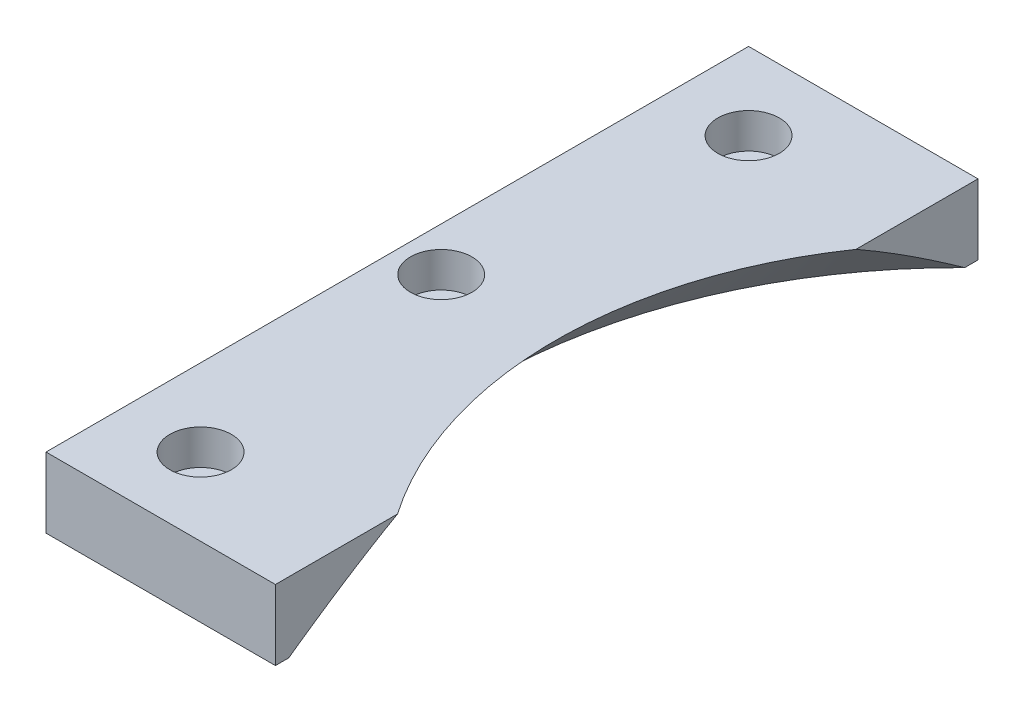
ISO-10303-21;
HEADER;
FILE_DESCRIPTION(('STEP AP214'),'2;1');
FILE_NAME('part.step','',(''),(''),'','','');
FILE_SCHEMA(('AUTOMOTIVE_DESIGN { 1 0 10303 214 1 1 1 1 }'));
ENDSEC;
DATA;
#1=APPLICATION_CONTEXT('core data for automotive mechanical design processes');
#2=APPLICATION_PROTOCOL_DEFINITION('international standard','automotive_design',2000,#1);
#3=PRODUCT_CONTEXT('',#1,'mechanical');
#4=PRODUCT('Part','Part','',(#3));
#5=PRODUCT_RELATED_PRODUCT_CATEGORY('part','',(#4));
#6=PRODUCT_DEFINITION_FORMATION('','',#4);
#7=PRODUCT_DEFINITION_CONTEXT('part definition',#1,'design');
#8=PRODUCT_DEFINITION('design','',#6,#7);
#9=PRODUCT_DEFINITION_SHAPE('','',#8);
#10=(LENGTH_UNIT() NAMED_UNIT(*) SI_UNIT(.MILLI.,.METRE.));
#11=(NAMED_UNIT(*) PLANE_ANGLE_UNIT() SI_UNIT($,.RADIAN.));
#12=(NAMED_UNIT(*) SI_UNIT($,.STERADIAN.) SOLID_ANGLE_UNIT());
#13=UNCERTAINTY_MEASURE_WITH_UNIT(LENGTH_MEASURE(1.E-05),#10,'distance_accuracy_value','');
#14=(GEOMETRIC_REPRESENTATION_CONTEXT(3) GLOBAL_UNCERTAINTY_ASSIGNED_CONTEXT((#13)) GLOBAL_UNIT_ASSIGNED_CONTEXT((#10,
#11,#12)) REPRESENTATION_CONTEXT('',''));
#15=CARTESIAN_POINT('',(0.,0.,0.));
#16=DIRECTION('',(0.,0.,1.));
#17=DIRECTION('',(1.,0.,0.));
#18=AXIS2_PLACEMENT_3D('',#15,#16,#17);
#19=CARTESIAN_POINT('',(-101.6,12.7,63.5));
#20=DIRECTION('',(0.,0.,-1.));
#21=DIRECTION('',(-1.,0.,0.));
#22=AXIS2_PLACEMENT_3D('',#19,#20,#21);
#23=PLANE('',#22);
#24=DIRECTION('',(1.,0.,0.));
#25=VECTOR('',#24,1.);
#26=CARTESIAN_POINT('',(-101.6,0.,63.5));
#27=LINE('',#26,#25);
#28=CARTESIAN_POINT('',(-101.6,0.,63.5));
#29=VERTEX_POINT('',#28);
#30=CARTESIAN_POINT('',(-60.1292839424142,0.,63.5));
#31=VERTEX_POINT('',#30);
#32=EDGE_CURVE('E127',#29,#31,#27,.T.);
#33=ORIENTED_EDGE('',*,*,#32,.T.);
#34=DIRECTION('',(0.,-1.,0.));
#35=VECTOR('',#34,1.);
#36=CARTESIAN_POINT('',(-60.1292839424142,12.7,63.5));
#37=LINE('',#36,#35);
#38=CARTESIAN_POINT('',(-60.1292839424142,12.7,63.5));
#39=VERTEX_POINT('',#38);
#40=EDGE_CURVE('E69',#39,#31,#37,.T.);
#41=ORIENTED_EDGE('',*,*,#40,.F.);
#42=DIRECTION('',(1.,0.,0.));
#43=VECTOR('',#42,1.);
#44=CARTESIAN_POINT('',(-101.6,12.7,63.5));
#45=LINE('',#44,#43);
#46=CARTESIAN_POINT('',(-101.6,12.7,63.5));
#47=VERTEX_POINT('',#46);
#48=EDGE_CURVE('E123',#47,#39,#45,.T.);
#49=ORIENTED_EDGE('',*,*,#48,.F.);
#50=DIRECTION('',(0.,-1.,0.));
#51=VECTOR('',#50,1.);
#52=CARTESIAN_POINT('',(-101.6,12.7,63.5));
#53=LINE('',#52,#51);
#54=EDGE_CURVE('E121',#47,#29,#53,.T.);
#55=ORIENTED_EDGE('',*,*,#54,.T.);
#56=EDGE_LOOP('',(#33,#41,#49,#55));
#57=FACE_BOUND('',#56,.T.);
#58=ADVANCED_FACE('F46',(#57),#23,.F.);
#59=CARTESIAN_POINT('',(0.,0.,0.));
#60=DIRECTION('',(0.,-1.,0.));
#61=DIRECTION('',(0.,0.,1.));
#62=AXIS2_PLACEMENT_3D('',#59,#60,#61);
#63=CONICAL_SURFACE('',#62,85.725,0.78539816339745);
#64=CARTESIAN_POINT('',(0.,0.,0.));
#65=DIRECTION('',(0.,-1.,0.));
#66=DIRECTION('',(0.,0.,1.));
#67=AXIS2_PLACEMENT_3D('',#64,#65,#66);
#68=CIRCLE('',#67,85.725);
#69=CARTESIAN_POINT('',(-60.1292839424142,0.,61.1002850858532));
#70=VERTEX_POINT('',#69);
#71=CARTESIAN_POINT('',(-60.1292839424142,0.,-61.1002850858532));
#72=VERTEX_POINT('',#71);
#73=EDGE_CURVE('E130',#70,#72,#68,.T.);
#74=ORIENTED_EDGE('',*,*,#73,.T.);
#75=CARTESIAN_POINT('',(-60.1292839424142,-66.7151779488328,-140.080252232941));
#76=CARTESIAN_POINT('',(-60.1292839424142,-64.8105041227983,-138.007458282815));
#77=CARTESIAN_POINT('',(-60.1292839424142,-62.9093328477956,-135.931437634323));
#78=CARTESIAN_POINT('',(-60.1292839424142,-59.1150950880149,-131.771974190512));
#79=CARTESIAN_POINT('',(-60.1292839424142,-57.2220286677997,-129.688531336309));
#80=CARTESIAN_POINT('',(-60.1292839424142,-53.4446952298806,-125.512806341657));
#81=CARTESIAN_POINT('',(-60.1292839424142,-51.5604303415947,-123.420522273977));
#82=CARTESIAN_POINT('',(-60.1292839424142,-47.8025391949186,-119.226425614269));
#83=CARTESIAN_POINT('',(-60.1292839424142,-45.928912914417,-117.124613042063));
#84=CARTESIAN_POINT('',(-60.1292839424142,-42.1822319226953,-112.896831173383));
#85=CARTESIAN_POINT('',(-60.1292839424142,-40.3092548031199,-110.770793075018));
#86=CARTESIAN_POINT('',(-60.1292839424142,-36.5778467817438,-106.505972534798));
#87=CARTESIAN_POINT('',(-60.1292839424142,-34.7194159118044,-104.367190065047));
#88=CARTESIAN_POINT('',(-60.1292839424142,-31.0198983940656,-100.075094384973));
#89=CARTESIAN_POINT('',(-60.1292839424142,-29.17880977515,-97.9217828749536));
#90=CARTESIAN_POINT('',(-60.1292839424142,-25.5169826379989,-93.5979191832601));
#91=CARTESIAN_POINT('',(-60.1292839424142,-23.6962440289681,-91.4273670785817));
#92=CARTESIAN_POINT('',(-60.1292839424142,-20.4018640116852,-87.4550281010579));
#93=CARTESIAN_POINT('',(-60.1292839424142,-18.9242503041055,-85.6565373923945));
#94=CARTESIAN_POINT('',(-60.1292839424142,-15.9883664995357,-82.0438098473816));
#95=CARTESIAN_POINT('',(-60.1292839424142,-14.5300964550652,-80.229572968302));
#96=CARTESIAN_POINT('',(-60.1292839424142,-11.6360236413316,-76.5824411528011));
#97=CARTESIAN_POINT('',(-60.1292839424142,-10.2002270480157,-74.7495413083204));
#98=CARTESIAN_POINT('',(-60.1292839424142,-7.355928665099,-71.0626795366914));
#99=CARTESIAN_POINT('',(-60.1292839424142,-5.94742666429568,-69.2087177726942));
#100=CARTESIAN_POINT('',(-60.1292839424142,-3.16483767366669,-65.4783571529654));
#101=CARTESIAN_POINT('',(-60.1292839424142,-1.79071319820268,-63.6019863558867));
#102=CARTESIAN_POINT('',(-60.1292839424142,0.240533087422979,-60.7659226985404));
#103=CARTESIAN_POINT('',(-60.1292839424142,0.912646019631489,-59.8169530335558));
#104=CARTESIAN_POINT('',(-60.1292839424142,2.24577724986897,-57.9112578961989));
#105=CARTESIAN_POINT('',(-60.1292839424142,2.90679566838311,-56.9545325082204));
#106=CARTESIAN_POINT('',(-60.1292839424142,4.21623853972302,-55.033094204741));
#107=CARTESIAN_POINT('',(-60.1292839424142,4.86466825605269,-54.0683848790403));
#108=CARTESIAN_POINT('',(-60.1292839424142,6.14780929107827,-52.1298988222721));
#109=CARTESIAN_POINT('',(-60.1292839424142,6.78252083401577,-51.1561222397938));
#110=CARTESIAN_POINT('',(-60.1292839424142,8.03657660104929,-49.1988302483792));
#111=CARTESIAN_POINT('',(-60.1292839424142,8.65592213998972,-48.2153156828527));
#112=CARTESIAN_POINT('',(-60.1292839424142,9.87744713691431,-46.2377033371553));
#113=CARTESIAN_POINT('',(-60.1292839424142,10.4796270259889,-45.2436058236224));
#114=CARTESIAN_POINT('',(-60.1292839424142,11.65881660595,-43.2539522199489));
#115=CARTESIAN_POINT('',(-60.1292839424142,12.2360174484062,-42.2585095861522));
#116=CARTESIAN_POINT('',(-60.1292839424142,13.369193089325,-40.2556071671935));
#117=CARTESIAN_POINT('',(-60.1292839424142,13.9251680834358,-39.2481474929103));
#118=CARTESIAN_POINT('',(-60.1292839424142,15.0132994790813,-37.220236353334));
#119=CARTESIAN_POINT('',(-60.1292839424142,15.5454525376028,-36.1997830902547));
#120=CARTESIAN_POINT('',(-60.1292839424142,16.58280987614,-34.1452481084478));
#121=CARTESIAN_POINT('',(-60.1292839424142,17.0880141461079,-33.111166384639));
#122=CARTESIAN_POINT('',(-60.1292839424142,18.06753902295,-31.0297183031837));
#123=CARTESIAN_POINT('',(-60.1292839424142,18.5418912733603,-29.9823669167387));
#124=CARTESIAN_POINT('',(-60.1292839424142,19.4564043843156,-27.8729201551548));
#125=CARTESIAN_POINT('',(-60.1292839424142,19.8965647755202,-26.810824577863));
#126=CARTESIAN_POINT('',(-60.1292839424142,21.1593602795503,-23.6020286496893));
#127=CARTESIAN_POINT('',(-60.1292839424142,21.9247352501614,-21.4319306343359));
#128=CARTESIAN_POINT('',(-60.1292839424142,22.8593566176515,-18.3641991024058));
#129=CARTESIAN_POINT('',(-60.1292839424142,23.1092090777267,-17.4906464157064));
#130=CARTESIAN_POINT('',(-60.1292839424142,23.5767439523241,-15.7350103374083));
#131=CARTESIAN_POINT('',(-60.1292839424142,23.7944303496925,-14.8529280163956));
#132=CARTESIAN_POINT('',(-60.1292839424142,24.195346413324,-13.0809863540706));
#133=CARTESIAN_POINT('',(-60.1292839424142,24.3785772287021,-12.1911272731544));
#134=CARTESIAN_POINT('',(-60.1292839424142,24.7084739307169,-10.4046267362287));
#135=CARTESIAN_POINT('',(-60.1292839424142,24.8551397385326,-9.50798526560313));
#136=CARTESIAN_POINT('',(-60.1292839424142,25.1097113201231,-7.71172059547721));
#137=CARTESIAN_POINT('',(-60.1292839424142,25.2177228871501,-6.81211244176346));
#138=CARTESIAN_POINT('',(-60.1292839424142,25.3941125569493,-5.00900694388113));
#139=CARTESIAN_POINT('',(-60.1292839424142,25.4624908223733,-4.10550961568872));
#140=CARTESIAN_POINT('',(-60.1292839424142,25.5586625239341,-2.29636172464643));
#141=CARTESIAN_POINT('',(-60.1292839424142,25.5864565358033,-1.39071119252468));
#142=CARTESIAN_POINT('',(-60.1292839424142,25.601065357599,0.420922230954417));
#143=CARTESIAN_POINT('',(-60.1292839424142,25.587880142325,1.32690512251582));
#144=CARTESIAN_POINT('',(-60.1292839424142,25.5207004750554,3.13785350356406));
#145=CARTESIAN_POINT('',(-60.1292839424142,25.4666834034577,4.04281815058976));
#146=CARTESIAN_POINT('',(-60.1292839424142,25.3185739687233,5.84944972528749));
#147=CARTESIAN_POINT('',(-60.1292839424142,25.2244815647723,6.75111664960008));
#148=CARTESIAN_POINT('',(-60.1292839424142,24.9974915472354,8.54958116090694));
#149=CARTESIAN_POINT('',(-60.1292839424142,24.864591929233,9.44637849394615));
#150=CARTESIAN_POINT('',(-60.1292839424142,24.5616913180025,11.2336674549911));
#151=CARTESIAN_POINT('',(-60.1292839424142,24.3916901050576,12.1241590456218));
#152=CARTESIAN_POINT('',(-60.1292839424142,24.0160589265646,13.9002983076545));
#153=CARTESIAN_POINT('',(-60.1292839424142,23.8103259950568,14.7859241319574));
#154=CARTESIAN_POINT('',(-60.1292839424142,23.3658181941614,16.5488502948019));
#155=CARTESIAN_POINT('',(-60.1292839424142,23.1270420765986,17.426150317506));
#156=CARTESIAN_POINT('',(-60.1292839424142,22.6188273921493,19.1717360072347));
#157=CARTESIAN_POINT('',(-60.1292839424142,22.3493911426586,20.0400223501373));
#158=CARTESIAN_POINT('',(-60.1292839424142,21.7822166157172,21.7672719090936));
#159=CARTESIAN_POINT('',(-60.1292839424142,21.484477309201,22.626234784891));
#160=CARTESIAN_POINT('',(-60.1292839424142,20.4246733109939,25.5398371917184));
#161=CARTESIAN_POINT('',(-60.1292839424142,19.6000454896787,27.5720225974067));
#162=CARTESIAN_POINT('',(-60.1292839424142,18.2724555086642,30.5798012679618));
#163=CARTESIAN_POINT('',(-60.1292839424142,17.8146712210476,31.5759279003449));
#164=CARTESIAN_POINT('',(-60.1292839424142,16.8720201854102,33.5553198056381));
#165=CARTESIAN_POINT('',(-60.1292839424142,16.3871541249753,34.5385854042987));
#166=CARTESIAN_POINT('',(-60.1292839424142,15.3924038645073,36.4945704037304));
#167=CARTESIAN_POINT('',(-60.1292839424142,14.8824759128718,37.4672674598918));
#168=CARTESIAN_POINT('',(-60.1292839424142,13.8410142464152,39.4010189890836));
#169=CARTESIAN_POINT('',(-60.1292839424142,13.3094803992555,40.3620733907545));
#170=CARTESIAN_POINT('',(-60.1292839424142,12.2272183526804,42.2730785220722));
#171=CARTESIAN_POINT('',(-60.1292839424142,11.6764934243555,43.223031107502));
#172=CARTESIAN_POINT('',(-60.1292839424142,10.5578012170886,45.1127123712399));
#173=CARTESIAN_POINT('',(-60.1292839424142,9.98983397400527,46.0524410708048));
#174=CARTESIAN_POINT('',(-60.1292839424142,8.83168977053155,47.9333487544436));
#175=CARTESIAN_POINT('',(-60.1292839424142,8.2413303583796,48.8744152646486));
#176=CARTESIAN_POINT('',(-60.1292839424142,7.04642448002915,50.7474882716691));
#177=CARTESIAN_POINT('',(-60.1292839424142,6.44187800527495,51.6794947630202));
#178=CARTESIAN_POINT('',(-60.1292839424142,5.22002284344117,53.5351120212098));
#179=CARTESIAN_POINT('',(-60.1292839424142,4.60271401651847,54.4587226958915));
#180=CARTESIAN_POINT('',(-60.1292839424142,3.35658702970031,56.2981529131588));
#181=CARTESIAN_POINT('',(-60.1292839424142,2.72776872695519,57.2139723588368));
#182=CARTESIAN_POINT('',(-60.1292839424142,0.827111525733622,59.9486440460033));
#183=CARTESIAN_POINT('',(-60.1292839424142,-0.460258230272219,61.7567170892624));
#184=CARTESIAN_POINT('',(-60.1292839424142,-3.06900582938046,65.3480416775588));
#185=CARTESIAN_POINT('',(-60.1292839424142,-4.39038332981841,67.131293472418));
#186=CARTESIAN_POINT('',(-60.1292839424142,-6.92803968372796,70.499324512369));
#187=CARTESIAN_POINT('',(-60.1292839424142,-8.14162952499546,72.0861332949625));
#188=CARTESIAN_POINT('',(-60.1292839424142,-10.5884359557615,75.244563291196));
#189=CARTESIAN_POINT('',(-60.1292839424142,-11.8216528151383,76.8161842955205));
#190=CARTESIAN_POINT('',(-60.1292839424142,-14.3050203535618,79.9461154792763));
#191=CARTESIAN_POINT('',(-60.1292839424142,-15.5551719510908,81.5044249291997));
#192=CARTESIAN_POINT('',(-60.1292839424142,-18.0700770933115,84.6091946837501));
#193=CARTESIAN_POINT('',(-60.1292839424142,-19.3348305735044,86.1556550406662));
#194=CARTESIAN_POINT('',(-60.1292839424142,-21.8779207619563,89.2391072986511));
#195=CARTESIAN_POINT('',(-60.1292839424142,-23.1562660347231,90.7760921310573));
#196=CARTESIAN_POINT('',(-60.1292839424142,-25.7241276484374,93.8406980882161));
#197=CARTESIAN_POINT('',(-60.1292839424142,-27.0136439997387,95.3683192042879));
#198=CARTESIAN_POINT('',(-60.1292839424142,-29.6024767220852,98.415148282988));
#199=CARTESIAN_POINT('',(-60.1292839424142,-30.9017927843505,99.9343565081044));
#200=CARTESIAN_POINT('',(-60.1292839424142,-33.5091423226831,102.96526783816));
#201=CARTESIAN_POINT('',(-60.1292839424142,-34.8171757945629,104.476970946704));
#202=CARTESIAN_POINT('',(-60.1292839424142,-38.6357544872334,108.867316645498));
#203=CARTESIAN_POINT('',(-60.1292839424142,-41.1565580110042,111.737040051389));
#204=CARTESIAN_POINT('',(-60.1292839424142,-46.2210024645861,117.456290811767));
#205=CARTESIAN_POINT('',(-60.1292839424142,-48.7646436468573,120.305817942368));
#206=CARTESIAN_POINT('',(-60.1292839424142,-52.5924877835991,124.565576466538));
#207=CARTESIAN_POINT('',(-60.1292839424142,-53.8696511571225,125.982142262436));
#208=CARTESIAN_POINT('',(-60.1292839424142,-56.428248791885,128.811413338891));
#209=CARTESIAN_POINT('',(-60.1292839424142,-57.7096830549979,130.224118617754));
#210=CARTESIAN_POINT('',(-60.1292839424142,-60.276405737082,133.045944903062));
#211=CARTESIAN_POINT('',(-60.1292839424142,-61.5616940391031,134.455066015917));
#212=CARTESIAN_POINT('',(-60.1292839424142,-64.1358392802082,137.270040310396));
#213=CARTESIAN_POINT('',(-60.1292839424142,-65.424696212599,138.675893498141));
#214=CARTESIAN_POINT('',(-60.1292839424142,-66.7151779488328,140.080252232941));
#215=B_SPLINE_CURVE_WITH_KNOTS('',3,(#75,#76,#77,#78,#79,#80,#81,#82,#83,#84,#85,#86,#87,#88,
#89,#90,#91,#92,#93,#94,#95,#96,#97,#98,#99,#100,#101,#102,#103,#104,#105,#106,#107,#108,#109,
#110,#111,#112,#113,#114,#115,#116,#117,#118,#119,#120,#121,#122,#123,#124,#125,#126,#127,#128,
#129,#130,#131,#132,#133,#134,#135,#136,#137,#138,#139,#140,#141,#142,#143,#144,#145,#146,#147,
#148,#149,#150,#151,#152,#153,#154,#155,#156,#157,#158,#159,#160,#161,#162,#163,#164,#165,#166,
#167,#168,#169,#170,#171,#172,#173,#174,#175,#176,#177,#178,#179,#180,#181,#182,#183,#184,#185,
#186,#187,#188,#189,#190,#191,#192,#193,#194,#195,#196,#197,#198,#199,#200,#201,#202,#203,#204,
#205,#206,#207,#208,#209,#210,#211,#212,#213,#214),.UNSPECIFIED.,.F.,.F.,(4,2,2,2,2,2,2,2,2,2,2,
2,2,2,2,2,2,2,2,2,2,2,2,2,2,2,2,2,2,2,2,2,2,2,2,2,2,2,2,2,2,2,2,2,2,2,2,2,2,2,2,2,2,2,2,2,2,2,2,
2,2,2,2,2,2,2,2,2,2,4),(0.,8.44502210851651,16.8901113647666,25.3371477174974,33.7841665073153,
42.2842708877352,50.7843938811708,59.2835388034575,67.7826457900904,74.7654560566486,
81.7482852782448,88.7330009072038,95.7176624676307,102.694342929449,106.182905158723,
109.671429478059,113.158462340483,116.645438159588,120.132114567416,123.618703335127,
127.070514408578,130.522293657446,133.974555797377,137.426819224494,140.875484086348,
144.324196278528,151.218670690548,153.943967004243,156.668925584708,159.393793269984,
162.118666829038,164.836024562074,167.553371143218,170.270679175428,172.98798887867,
175.706804992722,178.425623875715,181.14458321222,183.863558650936,186.590503290911,
189.317550966783,192.04439265997,194.771333535827,201.3447147166,204.6333176413,
207.921837108746,211.216316888394,214.510816850148,217.804757990022,221.098692280019,
224.431294107995,227.763897945795,231.096538319887,234.429220085076,241.08736363025,
247.745440113742,253.738332594222,259.73130755035,265.724608856792,271.717883699966,
277.715189918121,283.712501695387,289.709625285874,295.706745995911,307.165543914654,
318.62446866159,324.346370660501,330.068275170007,335.790007771954,341.511729649745),.UNSPECIFIED.);
#216=CARTESIAN_POINT('',(-60.1292839424142,12.7,-41.4381447168249));
#217=VERTEX_POINT('',#216);
#218=EDGE_CURVE('E62',#72,#217,#215,.T.);
#219=ORIENTED_EDGE('',*,*,#218,.T.);
#220=CARTESIAN_POINT('',(0.,12.7,0.));
#221=DIRECTION('',(0.,1.,0.));
#222=DIRECTION('',(0.,0.,1.));
#223=AXIS2_PLACEMENT_3D('',#220,#221,#222);
#224=CIRCLE('',#223,73.0249999999999);
#225=CARTESIAN_POINT('',(-60.1292839424142,12.7,41.4381447168249));
#226=VERTEX_POINT('',#225);
#227=EDGE_CURVE('E113',#226,#217,#224,.F.);
#228=ORIENTED_EDGE('',*,*,#227,.F.);
#229=EDGE_CURVE('E152',#226,#70,#215,.T.);
#230=ORIENTED_EDGE('',*,*,#229,.T.);
#231=EDGE_LOOP('',(#74,#219,#228,#230));
#232=FACE_BOUND('',#231,.T.);
#233=ADVANCED_FACE('F48',(#232),#63,.F.);
#234=CARTESIAN_POINT('',(-101.6,12.7,-63.5));
#235=DIRECTION('',(0.,0.,1.));
#236=DIRECTION('',(1.,0.,0.));
#237=AXIS2_PLACEMENT_3D('',#234,#235,#236);
#238=PLANE('',#237);
#239=DIRECTION('',(-1.,0.,0.));
#240=VECTOR('',#239,1.);
#241=CARTESIAN_POINT('',(-101.6,12.7,-63.5));
#242=LINE('',#241,#240);
#243=CARTESIAN_POINT('',(-60.1292839424142,12.7,-63.5));
#244=VERTEX_POINT('',#243);
#245=CARTESIAN_POINT('',(-101.6,12.7,-63.5));
#246=VERTEX_POINT('',#245);
#247=EDGE_CURVE('E109',#244,#246,#242,.T.);
#248=ORIENTED_EDGE('',*,*,#247,.F.);
#249=DIRECTION('',(0.,-1.,0.));
#250=VECTOR('',#249,1.);
#251=CARTESIAN_POINT('',(-60.1292839424142,12.7,-63.5));
#252=LINE('',#251,#250);
#253=CARTESIAN_POINT('',(-60.1292839424142,0.,-63.5));
#254=VERTEX_POINT('',#253);
#255=EDGE_CURVE('E97',#244,#254,#252,.T.);
#256=ORIENTED_EDGE('',*,*,#255,.T.);
#257=DIRECTION('',(-1.,0.,0.));
#258=VECTOR('',#257,1.);
#259=CARTESIAN_POINT('',(-101.6,0.,-63.5));
#260=LINE('',#259,#258);
#261=CARTESIAN_POINT('',(-101.6,0.,-63.5));
#262=VERTEX_POINT('',#261);
#263=EDGE_CURVE('E133',#254,#262,#260,.T.);
#264=ORIENTED_EDGE('',*,*,#263,.T.);
#265=DIRECTION('',(0.,-1.,0.));
#266=VECTOR('',#265,1.);
#267=CARTESIAN_POINT('',(-101.6,12.7,-63.5));
#268=LINE('',#267,#266);
#269=EDGE_CURVE('E55',#246,#262,#268,.T.);
#270=ORIENTED_EDGE('',*,*,#269,.F.);
#271=EDGE_LOOP('',(#248,#256,#264,#270));
#272=FACE_BOUND('',#271,.T.);
#273=ADVANCED_FACE('F116',(#272),#238,.F.);
#274=CARTESIAN_POINT('',(-101.6,12.7,63.5));
#275=DIRECTION('',(1.,0.,0.));
#276=DIRECTION('',(0.,0.,-1.));
#277=AXIS2_PLACEMENT_3D('',#274,#275,#276);
#278=PLANE('',#277);
#279=DIRECTION('',(0.,0.,1.));
#280=VECTOR('',#279,1.);
#281=CARTESIAN_POINT('',(-101.6,0.,63.5));
#282=LINE('',#281,#280);
#283=EDGE_CURVE('E135',#262,#29,#282,.T.);
#284=ORIENTED_EDGE('',*,*,#283,.T.);
#285=ORIENTED_EDGE('',*,*,#54,.F.);
#286=DIRECTION('',(0.,0.,1.));
#287=VECTOR('',#286,1.);
#288=CARTESIAN_POINT('',(-101.6,12.7,63.5));
#289=LINE('',#288,#287);
#290=EDGE_CURVE('E119',#246,#47,#289,.T.);
#291=ORIENTED_EDGE('',*,*,#290,.F.);
#292=ORIENTED_EDGE('',*,*,#269,.T.);
#293=EDGE_LOOP('',(#284,#285,#291,#292));
#294=FACE_BOUND('',#293,.T.);
#295=ADVANCED_FACE('F141',(#294),#278,.F.);
#296=CARTESIAN_POINT('',(0.,12.7,0.));
#297=DIRECTION('',(0.,1.,0.));
#298=DIRECTION('',(0.,0.,1.));
#299=AXIS2_PLACEMENT_3D('',#296,#297,#298);
#300=PLANE('',#299);
#301=CARTESIAN_POINT('',(-87.63,12.7,-49.53));
#302=DIRECTION('',(0.,1.,0.));
#303=DIRECTION('',(0.,0.,1.));
#304=AXIS2_PLACEMENT_3D('',#301,#302,#303);
#305=CIRCLE('',#304,5.55625);
#306=CARTESIAN_POINT('',(-87.63,12.7,-43.97375));
#307=VERTEX_POINT('',#306);
#308=EDGE_CURVE('E318',#307,#307,#305,.T.);
#309=ORIENTED_EDGE('',*,*,#308,.F.);
#310=EDGE_LOOP('',(#309));
#311=FACE_BOUND('',#310,.T.);
#312=CARTESIAN_POINT('',(-93.6625,12.7,0.));
#313=DIRECTION('',(0.,1.,0.));
#314=DIRECTION('',(0.,0.,1.));
#315=AXIS2_PLACEMENT_3D('',#312,#313,#314);
#316=CIRCLE('',#315,5.55625);
#317=CARTESIAN_POINT('',(-93.6625,12.7,5.5562499999999));
#318=VERTEX_POINT('',#317);
#319=EDGE_CURVE('E328',#318,#318,#316,.T.);
#320=ORIENTED_EDGE('',*,*,#319,.F.);
#321=EDGE_LOOP('',(#320));
#322=FACE_BOUND('',#321,.T.);
#323=CARTESIAN_POINT('',(-87.63,12.7,49.53));
#324=DIRECTION('',(0.,1.,0.));
#325=DIRECTION('',(0.,0.,1.));
#326=AXIS2_PLACEMENT_3D('',#323,#324,#325);
#327=CIRCLE('',#326,5.55625);
#328=CARTESIAN_POINT('',(-87.63,12.7,55.08625));
#329=VERTEX_POINT('',#328);
#330=EDGE_CURVE('E340',#329,#329,#327,.T.);
#331=ORIENTED_EDGE('',*,*,#330,.F.);
#332=EDGE_LOOP('',(#331));
#333=FACE_BOUND('',#332,.T.);
#334=DIRECTION('',(0.,0.,-1.));
#335=VECTOR('',#334,1.);
#336=CARTESIAN_POINT('',(-60.1292839424142,12.7,63.5));
#337=LINE('',#336,#335);
#338=EDGE_CURVE('E100',#217,#244,#337,.T.);
#339=ORIENTED_EDGE('',*,*,#338,.T.);
#340=ORIENTED_EDGE('',*,*,#247,.T.);
#341=ORIENTED_EDGE('',*,*,#290,.T.);
#342=ORIENTED_EDGE('',*,*,#48,.T.);
#343=EDGE_CURVE('E104',#39,#226,#337,.T.);
#344=ORIENTED_EDGE('',*,*,#343,.T.);
#345=ORIENTED_EDGE('',*,*,#227,.T.);
#346=EDGE_LOOP('',(#339,#340,#341,#342,#344,#345));
#347=FACE_BOUND('',#346,.T.);
#348=ADVANCED_FACE('F108',(#311,#322,#333,#347),#300,.T.);
#349=CARTESIAN_POINT('',(0.,0.,0.));
#350=DIRECTION('',(0.,1.,0.));
#351=DIRECTION('',(0.,0.,1.));
#352=AXIS2_PLACEMENT_3D('',#349,#350,#351);
#353=PLANE('',#352);
#354=CARTESIAN_POINT('',(-87.63,0.,-49.53));
#355=DIRECTION('',(0.,1.,0.));
#356=DIRECTION('',(0.,0.,1.));
#357=AXIS2_PLACEMENT_3D('',#354,#355,#356);
#358=CIRCLE('',#357,3.37820000000001);
#359=CARTESIAN_POINT('',(-87.63,0.,-46.1518));
#360=VERTEX_POINT('',#359);
#361=EDGE_CURVE('E325',#360,#360,#358,.T.);
#362=ORIENTED_EDGE('',*,*,#361,.T.);
#363=EDGE_LOOP('',(#362));
#364=FACE_BOUND('',#363,.T.);
#365=CARTESIAN_POINT('',(-93.6625,0.,0.));
#366=DIRECTION('',(0.,1.,0.));
#367=DIRECTION('',(0.,0.,1.));
#368=AXIS2_PLACEMENT_3D('',#365,#366,#367);
#369=CIRCLE('',#368,3.37820000000001);
#370=CARTESIAN_POINT('',(-93.6625,0.,3.37819999999991));
#371=VERTEX_POINT('',#370);
#372=EDGE_CURVE('E337',#371,#371,#369,.T.);
#373=ORIENTED_EDGE('',*,*,#372,.T.);
#374=EDGE_LOOP('',(#373));
#375=FACE_BOUND('',#374,.T.);
#376=CARTESIAN_POINT('',(-87.63,0.,49.53));
#377=DIRECTION('',(0.,1.,0.));
#378=DIRECTION('',(0.,0.,1.));
#379=AXIS2_PLACEMENT_3D('',#376,#377,#378);
#380=CIRCLE('',#379,3.37820000000001);
#381=CARTESIAN_POINT('',(-87.63,0.,52.9082));
#382=VERTEX_POINT('',#381);
#383=EDGE_CURVE('E349',#382,#382,#380,.T.);
#384=ORIENTED_EDGE('',*,*,#383,.T.);
#385=EDGE_LOOP('',(#384));
#386=FACE_BOUND('',#385,.T.);
#387=ORIENTED_EDGE('',*,*,#263,.F.);
#388=DIRECTION('',(0.,0.,1.));
#389=VECTOR('',#388,1.);
#390=CARTESIAN_POINT('',(-60.1292839424142,0.,0.));
#391=LINE('',#390,#389);
#392=EDGE_CURVE('E13',#254,#72,#391,.T.);
#393=ORIENTED_EDGE('',*,*,#392,.T.);
#394=ORIENTED_EDGE('',*,*,#73,.F.);
#395=DIRECTION('',(0.,0.,-1.));
#396=VECTOR('',#395,1.);
#397=CARTESIAN_POINT('',(-60.1292839424142,0.,63.5));
#398=LINE('',#397,#396);
#399=EDGE_CURVE('E114',#31,#70,#398,.T.);
#400=ORIENTED_EDGE('',*,*,#399,.F.);
#401=ORIENTED_EDGE('',*,*,#32,.F.);
#402=ORIENTED_EDGE('',*,*,#283,.F.);
#403=EDGE_LOOP('',(#387,#393,#394,#400,#401,#402));
#404=FACE_BOUND('',#403,.T.);
#405=ADVANCED_FACE('F145',(#364,#375,#386,#404),#353,.F.);
#406=CARTESIAN_POINT('',(-60.1292839424142,12.7,63.5));
#407=DIRECTION('',(-1.,0.,0.));
#408=DIRECTION('',(0.,0.,1.));
#409=AXIS2_PLACEMENT_3D('',#406,#407,#408);
#410=PLANE('',#409);
#411=ORIENTED_EDGE('',*,*,#343,.F.);
#412=ORIENTED_EDGE('',*,*,#40,.T.);
#413=ORIENTED_EDGE('',*,*,#399,.T.);
#414=ORIENTED_EDGE('',*,*,#229,.F.);
#415=EDGE_LOOP('',(#411,#412,#413,#414));
#416=FACE_BOUND('',#415,.T.);
#417=ADVANCED_FACE('F163',(#416),#410,.F.);
#418=ORIENTED_EDGE('',*,*,#392,.F.);
#419=ORIENTED_EDGE('',*,*,#255,.F.);
#420=ORIENTED_EDGE('',*,*,#338,.F.);
#421=ORIENTED_EDGE('',*,*,#218,.F.);
#422=EDGE_LOOP('',(#418,#419,#420,#421));
#423=FACE_BOUND('',#422,.T.);
#424=ADVANCED_FACE('F99',(#423),#410,.F.);
#425=CARTESIAN_POINT('',(-87.63,12.7,49.53));
#426=DIRECTION('',(0.,1.,0.));
#427=DIRECTION('',(0.,0.,1.));
#428=AXIS2_PLACEMENT_3D('',#425,#426,#427);
#429=CYLINDRICAL_SURFACE('',#428,3.3782);
#430=ORIENTED_EDGE('',*,*,#383,.F.);
#431=EDGE_LOOP('',(#430));
#432=FACE_BOUND('',#431,.T.);
#433=CARTESIAN_POINT('',(-87.63,6.35,49.53));
#434=DIRECTION('',(0.,1.,0.));
#435=DIRECTION('',(0.,0.,1.));
#436=AXIS2_PLACEMENT_3D('',#433,#434,#435);
#437=CIRCLE('',#436,3.3782);
#438=CARTESIAN_POINT('',(-87.63,6.35,52.9082));
#439=VERTEX_POINT('',#438);
#440=EDGE_CURVE('E346',#439,#439,#437,.T.);
#441=ORIENTED_EDGE('',*,*,#440,.T.);
#442=EDGE_LOOP('',(#441));
#443=FACE_BOUND('',#442,.T.);
#444=ADVANCED_FACE('F162',(#432,#443),#429,.F.);
#445=CARTESIAN_POINT('',(-84.2518,6.35,49.53));
#446=DIRECTION('',(0.,-1.,0.));
#447=DIRECTION('',(0.,0.,-1.));
#448=AXIS2_PLACEMENT_3D('',#445,#446,#447);
#449=PLANE('',#448);
#450=ORIENTED_EDGE('',*,*,#440,.F.);
#451=EDGE_LOOP('',(#450));
#452=FACE_BOUND('',#451,.T.);
#453=CARTESIAN_POINT('',(-87.63,6.35,49.53));
#454=DIRECTION('',(0.,1.,0.));
#455=DIRECTION('',(0.,0.,1.));
#456=AXIS2_PLACEMENT_3D('',#453,#454,#455);
#457=CIRCLE('',#456,5.55625);
#458=CARTESIAN_POINT('',(-87.63,6.35,55.08625));
#459=VERTEX_POINT('',#458);
#460=EDGE_CURVE('E343',#459,#459,#457,.T.);
#461=ORIENTED_EDGE('',*,*,#460,.T.);
#462=EDGE_LOOP('',(#461));
#463=FACE_BOUND('',#462,.T.);
#464=ADVANCED_FACE('F218',(#452,#463),#449,.F.);
#465=CARTESIAN_POINT('',(-87.63,12.7,49.53));
#466=DIRECTION('',(0.,1.,0.));
#467=DIRECTION('',(0.,0.,1.));
#468=AXIS2_PLACEMENT_3D('',#465,#466,#467);
#469=CYLINDRICAL_SURFACE('',#468,5.55625);
#470=ORIENTED_EDGE('',*,*,#460,.F.);
#471=EDGE_LOOP('',(#470));
#472=FACE_BOUND('',#471,.T.);
#473=ORIENTED_EDGE('',*,*,#330,.T.);
#474=EDGE_LOOP('',(#473));
#475=FACE_BOUND('',#474,.T.);
#476=ADVANCED_FACE('F226',(#472,#475),#469,.F.);
#477=CARTESIAN_POINT('',(-93.6625,12.7,0.));
#478=DIRECTION('',(0.,1.,0.));
#479=DIRECTION('',(0.,0.,1.));
#480=AXIS2_PLACEMENT_3D('',#477,#478,#479);
#481=CYLINDRICAL_SURFACE('',#480,3.3782);
#482=ORIENTED_EDGE('',*,*,#372,.F.);
#483=EDGE_LOOP('',(#482));
#484=FACE_BOUND('',#483,.T.);
#485=CARTESIAN_POINT('',(-93.6625,6.35,0.));
#486=DIRECTION('',(0.,1.,0.));
#487=DIRECTION('',(0.,0.,1.));
#488=AXIS2_PLACEMENT_3D('',#485,#486,#487);
#489=CIRCLE('',#488,3.3782);
#490=CARTESIAN_POINT('',(-93.6625,6.35,3.3781999999999));
#491=VERTEX_POINT('',#490);
#492=EDGE_CURVE('E334',#491,#491,#489,.T.);
#493=ORIENTED_EDGE('',*,*,#492,.T.);
#494=EDGE_LOOP('',(#493));
#495=FACE_BOUND('',#494,.T.);
#496=ADVANCED_FACE('F234',(#484,#495),#481,.F.);
#497=CARTESIAN_POINT('',(-90.2843,6.35,0.));
#498=DIRECTION('',(0.,-1.,0.));
#499=DIRECTION('',(0.,0.,-1.));
#500=AXIS2_PLACEMENT_3D('',#497,#498,#499);
#501=PLANE('',#500);
#502=ORIENTED_EDGE('',*,*,#492,.F.);
#503=EDGE_LOOP('',(#502));
#504=FACE_BOUND('',#503,.T.);
#505=CARTESIAN_POINT('',(-93.6625,6.35,0.));
#506=DIRECTION('',(0.,1.,0.));
#507=DIRECTION('',(0.,0.,1.));
#508=AXIS2_PLACEMENT_3D('',#505,#506,#507);
#509=CIRCLE('',#508,5.55625);
#510=CARTESIAN_POINT('',(-93.6625,6.35,5.5562499999999));
#511=VERTEX_POINT('',#510);
#512=EDGE_CURVE('E331',#511,#511,#509,.T.);
#513=ORIENTED_EDGE('',*,*,#512,.T.);
#514=EDGE_LOOP('',(#513));
#515=FACE_BOUND('',#514,.T.);
#516=ADVANCED_FACE('F243',(#504,#515),#501,.F.);
#517=CARTESIAN_POINT('',(-93.6625,12.7,0.));
#518=DIRECTION('',(0.,1.,0.));
#519=DIRECTION('',(0.,0.,1.));
#520=AXIS2_PLACEMENT_3D('',#517,#518,#519);
#521=CYLINDRICAL_SURFACE('',#520,5.55625);
#522=ORIENTED_EDGE('',*,*,#512,.F.);
#523=EDGE_LOOP('',(#522));
#524=FACE_BOUND('',#523,.T.);
#525=ORIENTED_EDGE('',*,*,#319,.T.);
#526=EDGE_LOOP('',(#525));
#527=FACE_BOUND('',#526,.T.);
#528=ADVANCED_FACE('F252',(#524,#527),#521,.F.);
#529=CARTESIAN_POINT('',(-87.63,12.7,-49.53));
#530=DIRECTION('',(0.,1.,0.));
#531=DIRECTION('',(0.,0.,1.));
#532=AXIS2_PLACEMENT_3D('',#529,#530,#531);
#533=CYLINDRICAL_SURFACE('',#532,3.3782);
#534=ORIENTED_EDGE('',*,*,#361,.F.);
#535=EDGE_LOOP('',(#534));
#536=FACE_BOUND('',#535,.T.);
#537=CARTESIAN_POINT('',(-87.63,6.35,-49.53));
#538=DIRECTION('',(0.,1.,0.));
#539=DIRECTION('',(0.,0.,1.));
#540=AXIS2_PLACEMENT_3D('',#537,#538,#539);
#541=CIRCLE('',#540,3.3782);
#542=CARTESIAN_POINT('',(-87.63,6.35,-46.1518));
#543=VERTEX_POINT('',#542);
#544=EDGE_CURVE('E320',#543,#543,#541,.T.);
#545=ORIENTED_EDGE('',*,*,#544,.T.);
#546=EDGE_LOOP('',(#545));
#547=FACE_BOUND('',#546,.T.);
#548=ADVANCED_FACE('F261',(#536,#547),#533,.F.);
#549=CARTESIAN_POINT('',(-84.2518,6.35,-49.53));
#550=DIRECTION('',(0.,-1.,0.));
#551=DIRECTION('',(0.,0.,-1.));
#552=AXIS2_PLACEMENT_3D('',#549,#550,#551);
#553=PLANE('',#552);
#554=ORIENTED_EDGE('',*,*,#544,.F.);
#555=EDGE_LOOP('',(#554));
#556=FACE_BOUND('',#555,.T.);
#557=CARTESIAN_POINT('',(-87.63,6.35,-49.53));
#558=DIRECTION('',(0.,1.,0.));
#559=DIRECTION('',(0.,0.,1.));
#560=AXIS2_PLACEMENT_3D('',#557,#558,#559);
#561=CIRCLE('',#560,5.55625);
#562=CARTESIAN_POINT('',(-87.63,6.35,-43.97375));
#563=VERTEX_POINT('',#562);
#564=EDGE_CURVE('E315',#563,#563,#561,.T.);
#565=ORIENTED_EDGE('',*,*,#564,.T.);
#566=EDGE_LOOP('',(#565));
#567=FACE_BOUND('',#566,.T.);
#568=ADVANCED_FACE('F270',(#556,#567),#553,.F.);
#569=CARTESIAN_POINT('',(-87.63,12.7,-49.53));
#570=DIRECTION('',(0.,1.,0.));
#571=DIRECTION('',(0.,0.,1.));
#572=AXIS2_PLACEMENT_3D('',#569,#570,#571);
#573=CYLINDRICAL_SURFACE('',#572,5.55625);
#574=ORIENTED_EDGE('',*,*,#564,.F.);
#575=EDGE_LOOP('',(#574));
#576=FACE_BOUND('',#575,.T.);
#577=ORIENTED_EDGE('',*,*,#308,.T.);
#578=EDGE_LOOP('',(#577));
#579=FACE_BOUND('',#578,.T.);
#580=ADVANCED_FACE('F279',(#576,#579),#573,.F.);
#581=CLOSED_SHELL('',(#58,#233,#273,#295,#348,#405,#417,#424,#444,#464,#476,#496,#516,#528,#548,
#568,#580));
#582=MANIFOLD_SOLID_BREP('B2',#581);
#583=ADVANCED_BREP_SHAPE_REPRESENTATION('',(#18,#582),#14);
#584=SHAPE_DEFINITION_REPRESENTATION(#9,#583);
ENDSEC;
END-ISO-10303-21;
